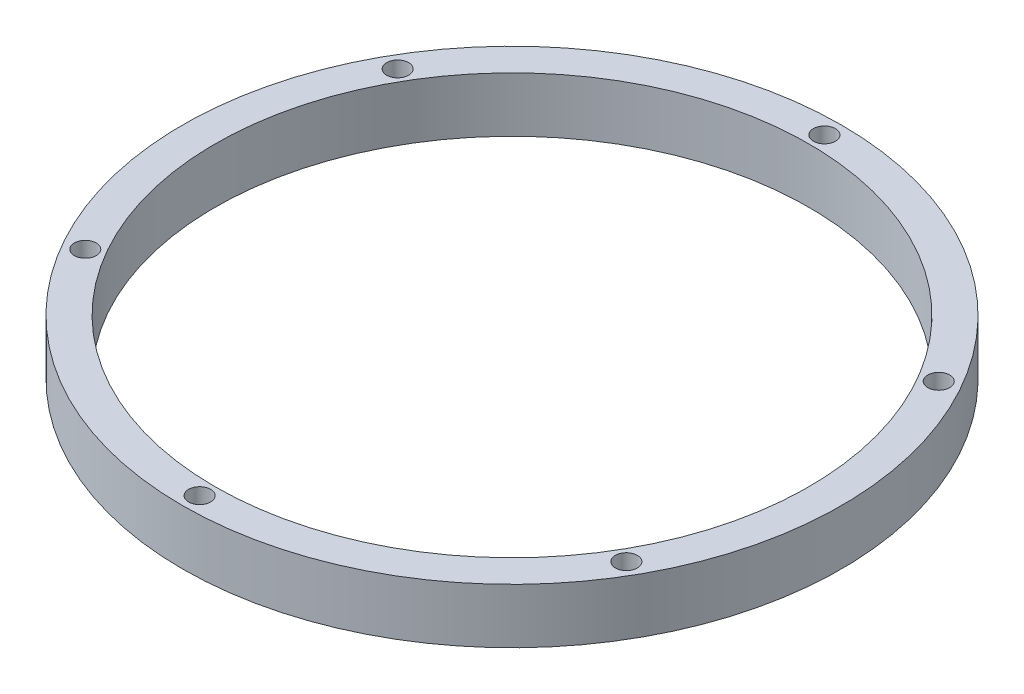
ISO-10303-21;
HEADER;
FILE_DESCRIPTION(('STEP AP214'),'2;1');
FILE_NAME('part.step','',(''),(''),'','','');
FILE_SCHEMA(('AUTOMOTIVE_DESIGN { 1 0 10303 214 1 1 1 1 }'));
ENDSEC;
DATA;
#1=APPLICATION_CONTEXT('core data for automotive mechanical design processes');
#2=APPLICATION_PROTOCOL_DEFINITION('international standard','automotive_design',2000,#1);
#3=PRODUCT_CONTEXT('',#1,'mechanical');
#4=PRODUCT('Part','Part','',(#3));
#5=PRODUCT_RELATED_PRODUCT_CATEGORY('part','',(#4));
#6=PRODUCT_DEFINITION_FORMATION('','',#4);
#7=PRODUCT_DEFINITION_CONTEXT('part definition',#1,'design');
#8=PRODUCT_DEFINITION('design','',#6,#7);
#9=PRODUCT_DEFINITION_SHAPE('','',#8);
#10=(LENGTH_UNIT() NAMED_UNIT(*) SI_UNIT(.MILLI.,.METRE.));
#11=(NAMED_UNIT(*) PLANE_ANGLE_UNIT() SI_UNIT($,.RADIAN.));
#12=(NAMED_UNIT(*) SI_UNIT($,.STERADIAN.) SOLID_ANGLE_UNIT());
#13=UNCERTAINTY_MEASURE_WITH_UNIT(LENGTH_MEASURE(1.E-05),#10,'distance_accuracy_value','');
#14=(GEOMETRIC_REPRESENTATION_CONTEXT(3) GLOBAL_UNCERTAINTY_ASSIGNED_CONTEXT((#13)) GLOBAL_UNIT_ASSIGNED_CONTEXT((#10,
#11,#12)) REPRESENTATION_CONTEXT('',''));
#15=CARTESIAN_POINT('',(0.,0.,0.));
#16=DIRECTION('',(0.,0.,1.));
#17=DIRECTION('',(1.,0.,0.));
#18=AXIS2_PLACEMENT_3D('',#15,#16,#17);
#19=CARTESIAN_POINT('',(0.,8.,0.));
#20=DIRECTION('',(0.,1.,0.));
#21=DIRECTION('',(0.,0.,1.));
#22=AXIS2_PLACEMENT_3D('',#19,#20,#21);
#23=PLANE('',#22);
#24=CARTESIAN_POINT('',(-39.404155872192,8.,22.75));
#25=DIRECTION('',(0.,1.,0.));
#26=DIRECTION('',(0.,0.,1.));
#27=AXIS2_PLACEMENT_3D('',#24,#25,#26);
#28=CIRCLE('',#27,1.6);
#29=CARTESIAN_POINT('',(-39.404155872192,8.,24.35));
#30=VERTEX_POINT('',#29);
#31=EDGE_CURVE('E79',#30,#30,#28,.T.);
#32=ORIENTED_EDGE('',*,*,#31,.F.);
#33=EDGE_LOOP('',(#32));
#34=FACE_BOUND('',#33,.T.);
#35=CARTESIAN_POINT('',(39.404155872192,8.,22.75));
#36=DIRECTION('',(0.,1.,0.));
#37=DIRECTION('',(0.,0.,1.));
#38=AXIS2_PLACEMENT_3D('',#35,#36,#37);
#39=CIRCLE('',#38,1.6);
#40=CARTESIAN_POINT('',(39.404155872192,8.,24.35));
#41=VERTEX_POINT('',#40);
#42=EDGE_CURVE('E61',#41,#41,#39,.T.);
#43=ORIENTED_EDGE('',*,*,#42,.F.);
#44=EDGE_LOOP('',(#43));
#45=FACE_BOUND('',#44,.T.);
#46=CARTESIAN_POINT('',(0.,8.,-45.5));
#47=DIRECTION('',(0.,1.,0.));
#48=DIRECTION('',(0.,0.,1.));
#49=AXIS2_PLACEMENT_3D('',#46,#47,#48);
#50=CIRCLE('',#49,1.6);
#51=CARTESIAN_POINT('',(0.,8.,-43.9));
#52=VERTEX_POINT('',#51);
#53=EDGE_CURVE('E52',#52,#52,#50,.T.);
#54=ORIENTED_EDGE('',*,*,#53,.F.);
#55=EDGE_LOOP('',(#54));
#56=FACE_BOUND('',#55,.T.);
#57=CARTESIAN_POINT('',(0.,8.,0.));
#58=DIRECTION('',(0.,1.,0.));
#59=DIRECTION('',(0.,0.,1.));
#60=AXIS2_PLACEMENT_3D('',#57,#58,#59);
#61=CIRCLE('',#60,48.);
#62=CARTESIAN_POINT('',(0.,8.,48.));
#63=VERTEX_POINT('',#62);
#64=EDGE_CURVE('E10',#63,#63,#61,.T.);
#65=ORIENTED_EDGE('',*,*,#64,.T.);
#66=EDGE_LOOP('',(#65));
#67=FACE_BOUND('',#66,.T.);
#68=CARTESIAN_POINT('',(0.,8.,0.));
#69=DIRECTION('',(0.,1.,0.));
#70=DIRECTION('',(0.,0.,1.));
#71=AXIS2_PLACEMENT_3D('',#68,#69,#70);
#72=CIRCLE('',#71,43.25);
#73=CARTESIAN_POINT('',(0.,8.,43.25));
#74=VERTEX_POINT('',#73);
#75=EDGE_CURVE('E48',#74,#74,#72,.T.);
#76=ORIENTED_EDGE('',*,*,#75,.F.);
#77=EDGE_LOOP('',(#76));
#78=FACE_BOUND('',#77,.T.);
#79=CARTESIAN_POINT('',(39.404155872192,8.,-22.75));
#80=DIRECTION('',(0.,1.,0.));
#81=DIRECTION('',(0.,0.,1.));
#82=AXIS2_PLACEMENT_3D('',#79,#80,#81);
#83=CIRCLE('',#82,1.6);
#84=CARTESIAN_POINT('',(39.404155872192,8.,-21.15));
#85=VERTEX_POINT('',#84);
#86=EDGE_CURVE('E56',#85,#85,#83,.T.);
#87=ORIENTED_EDGE('',*,*,#86,.F.);
#88=EDGE_LOOP('',(#87));
#89=FACE_BOUND('',#88,.T.);
#90=CARTESIAN_POINT('',(0.,8.,45.5));
#91=DIRECTION('',(0.,1.,0.));
#92=DIRECTION('',(0.,0.,1.));
#93=AXIS2_PLACEMENT_3D('',#90,#91,#92);
#94=CIRCLE('',#93,1.6);
#95=CARTESIAN_POINT('',(0.,8.,47.1));
#96=VERTEX_POINT('',#95);
#97=EDGE_CURVE('E72',#96,#96,#94,.T.);
#98=ORIENTED_EDGE('',*,*,#97,.F.);
#99=EDGE_LOOP('',(#98));
#100=FACE_BOUND('',#99,.T.);
#101=CARTESIAN_POINT('',(-39.404155872192,8.,-22.75));
#102=DIRECTION('',(0.,1.,0.));
#103=DIRECTION('',(0.,0.,1.));
#104=AXIS2_PLACEMENT_3D('',#101,#102,#103);
#105=CIRCLE('',#104,1.6);
#106=CARTESIAN_POINT('',(-39.404155872192,8.,-21.15));
#107=VERTEX_POINT('',#106);
#108=EDGE_CURVE('E84',#107,#107,#105,.T.);
#109=ORIENTED_EDGE('',*,*,#108,.F.);
#110=EDGE_LOOP('',(#109));
#111=FACE_BOUND('',#110,.T.);
#112=ADVANCED_FACE('F40',(#34,#45,#56,#67,#78,#89,#100,#111),#23,.T.);
#113=CARTESIAN_POINT('',(0.,0.,0.));
#114=DIRECTION('',(0.,1.,0.));
#115=DIRECTION('',(0.,0.,1.));
#116=AXIS2_PLACEMENT_3D('',#113,#114,#115);
#117=PLANE('',#116);
#118=CARTESIAN_POINT('',(0.,0.,0.));
#119=DIRECTION('',(0.,1.,0.));
#120=DIRECTION('',(0.,0.,1.));
#121=AXIS2_PLACEMENT_3D('',#118,#119,#120);
#122=CIRCLE('',#121,48.);
#123=CARTESIAN_POINT('',(0.,0.,48.));
#124=VERTEX_POINT('',#123);
#125=EDGE_CURVE('E41',#124,#124,#122,.T.);
#126=ORIENTED_EDGE('',*,*,#125,.F.);
#127=EDGE_LOOP('',(#126));
#128=FACE_BOUND('',#127,.T.);
#129=CARTESIAN_POINT('',(0.,0.,0.));
#130=DIRECTION('',(0.,1.,0.));
#131=DIRECTION('',(0.,0.,1.));
#132=AXIS2_PLACEMENT_3D('',#129,#130,#131);
#133=CIRCLE('',#132,43.25);
#134=CARTESIAN_POINT('',(0.,0.,43.25));
#135=VERTEX_POINT('',#134);
#136=EDGE_CURVE('E49',#135,#135,#133,.T.);
#137=ORIENTED_EDGE('',*,*,#136,.T.);
#138=EDGE_LOOP('',(#137));
#139=FACE_BOUND('',#138,.T.);
#140=CARTESIAN_POINT('',(0.,0.,-45.5));
#141=DIRECTION('',(0.,1.,0.));
#142=DIRECTION('',(0.,0.,1.));
#143=AXIS2_PLACEMENT_3D('',#140,#141,#142);
#144=CIRCLE('',#143,1.6);
#145=CARTESIAN_POINT('',(0.,0.,-43.9));
#146=VERTEX_POINT('',#145);
#147=EDGE_CURVE('E57',#146,#146,#144,.T.);
#148=ORIENTED_EDGE('',*,*,#147,.T.);
#149=EDGE_LOOP('',(#148));
#150=FACE_BOUND('',#149,.T.);
#151=CARTESIAN_POINT('',(39.404155872192,0.,-22.75));
#152=DIRECTION('',(0.,1.,0.));
#153=DIRECTION('',(0.,0.,1.));
#154=AXIS2_PLACEMENT_3D('',#151,#152,#153);
#155=CIRCLE('',#154,1.6);
#156=CARTESIAN_POINT('',(39.404155872192,0.,-21.15));
#157=VERTEX_POINT('',#156);
#158=EDGE_CURVE('E64',#157,#157,#155,.T.);
#159=ORIENTED_EDGE('',*,*,#158,.T.);
#160=EDGE_LOOP('',(#159));
#161=FACE_BOUND('',#160,.T.);
#162=CARTESIAN_POINT('',(39.404155872192,0.,22.75));
#163=DIRECTION('',(0.,1.,0.));
#164=DIRECTION('',(0.,0.,1.));
#165=AXIS2_PLACEMENT_3D('',#162,#163,#164);
#166=CIRCLE('',#165,1.6);
#167=CARTESIAN_POINT('',(39.404155872192,0.,24.35));
#168=VERTEX_POINT('',#167);
#169=EDGE_CURVE('E69',#168,#168,#166,.T.);
#170=ORIENTED_EDGE('',*,*,#169,.T.);
#171=EDGE_LOOP('',(#170));
#172=FACE_BOUND('',#171,.T.);
#173=CARTESIAN_POINT('',(0.,0.,45.5));
#174=DIRECTION('',(0.,1.,0.));
#175=DIRECTION('',(0.,0.,1.));
#176=AXIS2_PLACEMENT_3D('',#173,#174,#175);
#177=CIRCLE('',#176,1.6);
#178=CARTESIAN_POINT('',(0.,0.,47.1));
#179=VERTEX_POINT('',#178);
#180=EDGE_CURVE('E74',#179,#179,#177,.T.);
#181=ORIENTED_EDGE('',*,*,#180,.T.);
#182=EDGE_LOOP('',(#181));
#183=FACE_BOUND('',#182,.T.);
#184=CARTESIAN_POINT('',(-39.404155872192,0.,22.75));
#185=DIRECTION('',(0.,1.,0.));
#186=DIRECTION('',(0.,0.,1.));
#187=AXIS2_PLACEMENT_3D('',#184,#185,#186);
#188=CIRCLE('',#187,1.6);
#189=CARTESIAN_POINT('',(-39.404155872192,0.,24.35));
#190=VERTEX_POINT('',#189);
#191=EDGE_CURVE('E76',#190,#190,#188,.T.);
#192=ORIENTED_EDGE('',*,*,#191,.T.);
#193=EDGE_LOOP('',(#192));
#194=FACE_BOUND('',#193,.T.);
#195=CARTESIAN_POINT('',(-39.404155872192,0.,-22.75));
#196=DIRECTION('',(0.,1.,0.));
#197=DIRECTION('',(0.,0.,1.));
#198=AXIS2_PLACEMENT_3D('',#195,#196,#197);
#199=CIRCLE('',#198,1.6);
#200=CARTESIAN_POINT('',(-39.404155872192,0.,-21.15));
#201=VERTEX_POINT('',#200);
#202=EDGE_CURVE('E88',#201,#201,#199,.T.);
#203=ORIENTED_EDGE('',*,*,#202,.T.);
#204=EDGE_LOOP('',(#203));
#205=FACE_BOUND('',#204,.T.);
#206=ADVANCED_FACE('F96',(#128,#139,#150,#161,#172,#183,#194,#205),#117,.F.);
#207=CARTESIAN_POINT('',(0.,8.,0.));
#208=DIRECTION('',(0.,-1.,0.));
#209=DIRECTION('',(0.,0.,-1.));
#210=AXIS2_PLACEMENT_3D('',#207,#208,#209);
#211=CYLINDRICAL_SURFACE('',#210,48.);
#212=ORIENTED_EDGE('',*,*,#64,.F.);
#213=EDGE_LOOP('',(#212));
#214=FACE_BOUND('',#213,.T.);
#215=ORIENTED_EDGE('',*,*,#125,.T.);
#216=EDGE_LOOP('',(#215));
#217=FACE_BOUND('',#216,.T.);
#218=ADVANCED_FACE('F39',(#214,#217),#211,.T.);
#219=CARTESIAN_POINT('',(0.,8.,0.));
#220=DIRECTION('',(0.,-1.,0.));
#221=DIRECTION('',(0.,0.,-1.));
#222=AXIS2_PLACEMENT_3D('',#219,#220,#221);
#223=CYLINDRICAL_SURFACE('',#222,43.25);
#224=ORIENTED_EDGE('',*,*,#75,.T.);
#225=EDGE_LOOP('',(#224));
#226=FACE_BOUND('',#225,.T.);
#227=ORIENTED_EDGE('',*,*,#136,.F.);
#228=EDGE_LOOP('',(#227));
#229=FACE_BOUND('',#228,.T.);
#230=ADVANCED_FACE('F106',(#226,#229),#223,.F.);
#231=CARTESIAN_POINT('',(0.,8.,-45.5));
#232=DIRECTION('',(0.,-1.,0.));
#233=DIRECTION('',(0.,0.,-1.));
#234=AXIS2_PLACEMENT_3D('',#231,#232,#233);
#235=CYLINDRICAL_SURFACE('',#234,1.6);
#236=ORIENTED_EDGE('',*,*,#53,.T.);
#237=EDGE_LOOP('',(#236));
#238=FACE_BOUND('',#237,.T.);
#239=ORIENTED_EDGE('',*,*,#147,.F.);
#240=EDGE_LOOP('',(#239));
#241=FACE_BOUND('',#240,.T.);
#242=ADVANCED_FACE('F108',(#238,#241),#235,.F.);
#243=CARTESIAN_POINT('',(39.404155872192,8.,-22.75));
#244=DIRECTION('',(0.,-1.,0.));
#245=DIRECTION('',(0.,0.,-1.));
#246=AXIS2_PLACEMENT_3D('',#243,#244,#245);
#247=CYLINDRICAL_SURFACE('',#246,1.6);
#248=ORIENTED_EDGE('',*,*,#86,.T.);
#249=EDGE_LOOP('',(#248));
#250=FACE_BOUND('',#249,.T.);
#251=ORIENTED_EDGE('',*,*,#158,.F.);
#252=EDGE_LOOP('',(#251));
#253=FACE_BOUND('',#252,.T.);
#254=ADVANCED_FACE('F114',(#250,#253),#247,.F.);
#255=CARTESIAN_POINT('',(39.404155872192,8.,22.75));
#256=DIRECTION('',(0.,-1.,0.));
#257=DIRECTION('',(0.,0.,-1.));
#258=AXIS2_PLACEMENT_3D('',#255,#256,#257);
#259=CYLINDRICAL_SURFACE('',#258,1.6);
#260=ORIENTED_EDGE('',*,*,#42,.T.);
#261=EDGE_LOOP('',(#260));
#262=FACE_BOUND('',#261,.T.);
#263=ORIENTED_EDGE('',*,*,#169,.F.);
#264=EDGE_LOOP('',(#263));
#265=FACE_BOUND('',#264,.T.);
#266=ADVANCED_FACE('F119',(#262,#265),#259,.F.);
#267=CARTESIAN_POINT('',(0.,8.,45.5));
#268=DIRECTION('',(0.,-1.,0.));
#269=DIRECTION('',(0.,0.,-1.));
#270=AXIS2_PLACEMENT_3D('',#267,#268,#269);
#271=CYLINDRICAL_SURFACE('',#270,1.6);
#272=ORIENTED_EDGE('',*,*,#97,.T.);
#273=EDGE_LOOP('',(#272));
#274=FACE_BOUND('',#273,.T.);
#275=ORIENTED_EDGE('',*,*,#180,.F.);
#276=EDGE_LOOP('',(#275));
#277=FACE_BOUND('',#276,.T.);
#278=ADVANCED_FACE('F121',(#274,#277),#271,.F.);
#279=CARTESIAN_POINT('',(-39.404155872192,8.,22.75));
#280=DIRECTION('',(0.,-1.,0.));
#281=DIRECTION('',(0.,0.,-1.));
#282=AXIS2_PLACEMENT_3D('',#279,#280,#281);
#283=CYLINDRICAL_SURFACE('',#282,1.6);
#284=ORIENTED_EDGE('',*,*,#31,.T.);
#285=EDGE_LOOP('',(#284));
#286=FACE_BOUND('',#285,.T.);
#287=ORIENTED_EDGE('',*,*,#191,.F.);
#288=EDGE_LOOP('',(#287));
#289=FACE_BOUND('',#288,.T.);
#290=ADVANCED_FACE('F125',(#286,#289),#283,.F.);
#291=CARTESIAN_POINT('',(-39.404155872192,8.,-22.75));
#292=DIRECTION('',(0.,-1.,0.));
#293=DIRECTION('',(0.,0.,-1.));
#294=AXIS2_PLACEMENT_3D('',#291,#292,#293);
#295=CYLINDRICAL_SURFACE('',#294,1.6);
#296=ORIENTED_EDGE('',*,*,#108,.T.);
#297=EDGE_LOOP('',(#296));
#298=FACE_BOUND('',#297,.T.);
#299=ORIENTED_EDGE('',*,*,#202,.F.);
#300=EDGE_LOOP('',(#299));
#301=FACE_BOUND('',#300,.T.);
#302=ADVANCED_FACE('F95',(#298,#301),#295,.F.);
#303=CLOSED_SHELL('',(#112,#206,#218,#230,#242,#254,#266,#278,#290,#302));
#304=MANIFOLD_SOLID_BREP('B2',#303);
#305=ADVANCED_BREP_SHAPE_REPRESENTATION('',(#18,#304),#14);
#306=SHAPE_DEFINITION_REPRESENTATION(#9,#305);
ENDSEC;
END-ISO-10303-21;
